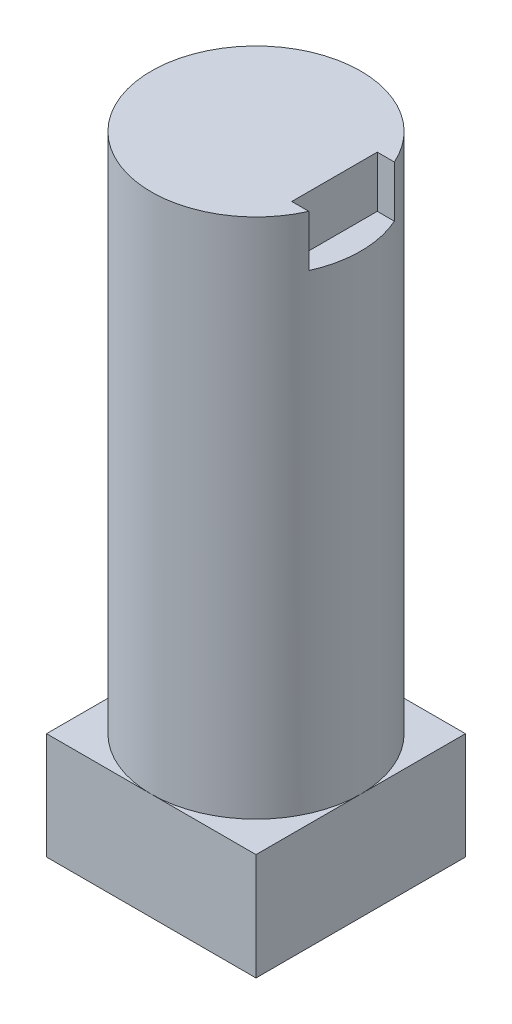
ISO-10303-21;
HEADER;
FILE_DESCRIPTION(('STEP AP214'),'2;1');
FILE_NAME('part.step','',(''),(''),'','','');
FILE_SCHEMA(('AUTOMOTIVE_DESIGN { 1 0 10303 214 1 1 1 1 }'));
ENDSEC;
DATA;
#1=APPLICATION_CONTEXT('core data for automotive mechanical design processes');
#2=APPLICATION_PROTOCOL_DEFINITION('international standard','automotive_design',2000,#1);
#3=PRODUCT_CONTEXT('',#1,'mechanical');
#4=PRODUCT('Part','Part','',(#3));
#5=PRODUCT_RELATED_PRODUCT_CATEGORY('part','',(#4));
#6=PRODUCT_DEFINITION_FORMATION('','',#4);
#7=PRODUCT_DEFINITION_CONTEXT('part definition',#1,'design');
#8=PRODUCT_DEFINITION('design','',#6,#7);
#9=PRODUCT_DEFINITION_SHAPE('','',#8);
#10=(LENGTH_UNIT() NAMED_UNIT(*) SI_UNIT(.MILLI.,.METRE.));
#11=(NAMED_UNIT(*) PLANE_ANGLE_UNIT() SI_UNIT($,.RADIAN.));
#12=(NAMED_UNIT(*) SI_UNIT($,.STERADIAN.) SOLID_ANGLE_UNIT());
#13=UNCERTAINTY_MEASURE_WITH_UNIT(LENGTH_MEASURE(1.E-05),#10,'distance_accuracy_value','');
#14=(GEOMETRIC_REPRESENTATION_CONTEXT(3) GLOBAL_UNCERTAINTY_ASSIGNED_CONTEXT((#13)) GLOBAL_UNIT_ASSIGNED_CONTEXT((#10,
#11,#12)) REPRESENTATION_CONTEXT('',''));
#15=CARTESIAN_POINT('',(0.,0.,0.));
#16=DIRECTION('',(0.,0.,1.));
#17=DIRECTION('',(1.,0.,0.));
#18=AXIS2_PLACEMENT_3D('',#15,#16,#17);
#19=CARTESIAN_POINT('',(-34.9241184124081,14.412388078501,22.3609994216903));
#20=DIRECTION('',(0.,-1.,0.));
#21=DIRECTION('',(0.,0.,-1.));
#22=AXIS2_PLACEMENT_3D('',#19,#20,#21);
#23=CYLINDRICAL_SURFACE('',#22,2.45);
#24=CARTESIAN_POINT('',(-34.9241184124081,-3.28761192149899,22.3609994216903));
#25=DIRECTION('',(0.,1.,0.));
#26=DIRECTION('',(0.,0.,1.));
#27=AXIS2_PLACEMENT_3D('',#24,#25,#26);
#28=CIRCLE('',#27,2.45);
#29=CARTESIAN_POINT('',(-34.9241184124081,-3.28761192149899,24.8109994216903));
#30=VERTEX_POINT('',#29);
#31=CARTESIAN_POINT('',(-32.4741184124081,-3.28761192149899,22.3609994216903));
#32=VERTEX_POINT('',#31);
#33=EDGE_CURVE('E153',#30,#32,#28,.T.);
#34=ORIENTED_EDGE('',*,*,#33,.T.);
#35=CARTESIAN_POINT('',(-34.9241184124081,-3.28761192149899,19.9109994216903));
#36=VERTEX_POINT('',#35);
#37=EDGE_CURVE('E57',#32,#36,#28,.T.);
#38=ORIENTED_EDGE('',*,*,#37,.T.);
#39=CARTESIAN_POINT('',(-37.3741184124081,-3.28761192149899,22.3609994216903));
#40=VERTEX_POINT('',#39);
#41=EDGE_CURVE('E207',#36,#40,#28,.T.);
#42=ORIENTED_EDGE('',*,*,#41,.T.);
#43=EDGE_CURVE('E71',#40,#30,#28,.T.);
#44=ORIENTED_EDGE('',*,*,#43,.T.);
#45=EDGE_LOOP('',(#34,#38,#42,#44));
#46=FACE_BOUND('',#45,.T.);
#47=CARTESIAN_POINT('',(-34.9241184124081,8.91238807850102,22.3609994216903));
#48=DIRECTION('',(0.,1.,0.));
#49=DIRECTION('',(0.,0.,1.));
#50=AXIS2_PLACEMENT_3D('',#47,#48,#49);
#51=CIRCLE('',#50,2.45);
#52=CARTESIAN_POINT('',(-32.6874914877736,8.91238807850102,23.3609994216903));
#53=VERTEX_POINT('',#52);
#54=CARTESIAN_POINT('',(-32.6874914877736,8.91238807850102,21.3609994216903));
#55=VERTEX_POINT('',#54);
#56=EDGE_CURVE('E125',#53,#55,#51,.F.);
#57=ORIENTED_EDGE('',*,*,#56,.T.);
#58=DIRECTION('',(0.,1.,0.));
#59=VECTOR('',#58,1.);
#60=CARTESIAN_POINT('',(-32.6874914877736,7.71238807850101,21.3609994216903));
#61=LINE('',#60,#59);
#62=CARTESIAN_POINT('',(-32.6874914877736,7.71238807850101,21.3609994216903));
#63=VERTEX_POINT('',#62);
#64=EDGE_CURVE('E134',#63,#55,#61,.T.);
#65=ORIENTED_EDGE('',*,*,#64,.F.);
#66=CARTESIAN_POINT('',(-34.9241184124081,7.71238807850101,22.3609994216903));
#67=DIRECTION('',(0.,1.,0.));
#68=DIRECTION('',(0.,0.,1.));
#69=AXIS2_PLACEMENT_3D('',#66,#67,#68);
#70=CIRCLE('',#69,2.45);
#71=CARTESIAN_POINT('',(-32.6874914877736,7.71238807850101,23.3609994216903));
#72=VERTEX_POINT('',#71);
#73=EDGE_CURVE('E238',#72,#63,#70,.T.);
#74=ORIENTED_EDGE('',*,*,#73,.F.);
#75=DIRECTION('',(0.,1.,0.));
#76=VECTOR('',#75,1.);
#77=CARTESIAN_POINT('',(-32.6874914877736,7.71238807850101,23.3609994216903));
#78=LINE('',#77,#76);
#79=EDGE_CURVE('E135',#72,#53,#78,.T.);
#80=ORIENTED_EDGE('',*,*,#79,.T.);
#81=EDGE_LOOP('',(#57,#65,#74,#80));
#82=FACE_BOUND('',#81,.T.);
#83=ADVANCED_FACE('F48',(#46,#82),#23,.T.);
#84=CARTESIAN_POINT('',(-30.3076921273144,7.71238807850101,23.3609994216903));
#85=DIRECTION('',(0.,0.,-1.));
#86=DIRECTION('',(-1.,0.,0.));
#87=AXIS2_PLACEMENT_3D('',#84,#85,#86);
#88=PLANE('',#87);
#89=DIRECTION('',(0.,1.,0.));
#90=VECTOR('',#89,1.);
#91=CARTESIAN_POINT('',(-33.0874914877736,7.71238807850101,23.3609994216903));
#92=LINE('',#91,#90);
#93=CARTESIAN_POINT('',(-33.0874914877736,7.71238807850101,23.3609994216903));
#94=VERTEX_POINT('',#93);
#95=CARTESIAN_POINT('',(-33.0874914877736,8.91238807850101,23.3609994216903));
#96=VERTEX_POINT('',#95);
#97=EDGE_CURVE('E147',#94,#96,#92,.T.);
#98=ORIENTED_EDGE('',*,*,#97,.T.);
#99=DIRECTION('',(1.,0.,0.));
#100=VECTOR('',#99,1.);
#101=CARTESIAN_POINT('',(-30.3076921273144,8.91238807850101,23.3609994216903));
#102=LINE('',#101,#100);
#103=EDGE_CURVE('E244',#96,#53,#102,.T.);
#104=ORIENTED_EDGE('',*,*,#103,.T.);
#105=ORIENTED_EDGE('',*,*,#79,.F.);
#106=DIRECTION('',(-1.,0.,0.));
#107=VECTOR('',#106,1.);
#108=CARTESIAN_POINT('',(-30.3076921273144,7.71238807850101,23.3609994216903));
#109=LINE('',#108,#107);
#110=EDGE_CURVE('E241',#72,#94,#109,.T.);
#111=ORIENTED_EDGE('',*,*,#110,.T.);
#112=EDGE_LOOP('',(#98,#104,#105,#111));
#113=FACE_BOUND('',#112,.T.);
#114=ADVANCED_FACE('F248',(#113),#88,.T.);
#115=CARTESIAN_POINT('',(-33.0874914877736,7.71238807850101,7.79325973955173));
#116=DIRECTION('',(-1.,0.,0.));
#117=DIRECTION('',(0.,0.,1.));
#118=AXIS2_PLACEMENT_3D('',#115,#116,#117);
#119=PLANE('',#118);
#120=DIRECTION('',(0.,0.,-1.));
#121=VECTOR('',#120,1.);
#122=CARTESIAN_POINT('',(-33.0874914877736,8.91238807850101,7.79325973955173));
#123=LINE('',#122,#121);
#124=CARTESIAN_POINT('',(-33.0874914877736,8.91238807850101,21.3609994216903));
#125=VERTEX_POINT('',#124);
#126=EDGE_CURVE('E63',#96,#125,#123,.T.);
#127=ORIENTED_EDGE('',*,*,#126,.F.);
#128=ORIENTED_EDGE('',*,*,#97,.F.);
#129=DIRECTION('',(0.,0.,1.));
#130=VECTOR('',#129,1.);
#131=CARTESIAN_POINT('',(-33.0874914877736,7.71238807850101,7.79325973955173));
#132=LINE('',#131,#130);
#133=CARTESIAN_POINT('',(-33.0874914877736,7.71238807850101,21.3609994216903));
#134=VERTEX_POINT('',#133);
#135=EDGE_CURVE('E149',#134,#94,#132,.T.);
#136=ORIENTED_EDGE('',*,*,#135,.F.);
#137=DIRECTION('',(0.,1.,0.));
#138=VECTOR('',#137,1.);
#139=CARTESIAN_POINT('',(-33.0874914877736,7.71238807850101,21.3609994216903));
#140=LINE('',#139,#138);
#141=EDGE_CURVE('E143',#134,#125,#140,.T.);
#142=ORIENTED_EDGE('',*,*,#141,.T.);
#143=EDGE_LOOP('',(#127,#128,#136,#142));
#144=FACE_BOUND('',#143,.T.);
#145=ADVANCED_FACE('F251',(#144),#119,.F.);
#146=CARTESIAN_POINT('',(-30.3076921273144,7.71238807850101,21.3609994216903));
#147=DIRECTION('',(0.,0.,-1.));
#148=DIRECTION('',(-1.,0.,0.));
#149=AXIS2_PLACEMENT_3D('',#146,#147,#148);
#150=PLANE('',#149);
#151=DIRECTION('',(1.,0.,0.));
#152=VECTOR('',#151,1.);
#153=CARTESIAN_POINT('',(-30.3076921273144,8.91238807850101,21.3609994216903));
#154=LINE('',#153,#152);
#155=EDGE_CURVE('E13',#125,#55,#154,.T.);
#156=ORIENTED_EDGE('',*,*,#155,.F.);
#157=ORIENTED_EDGE('',*,*,#141,.F.);
#158=DIRECTION('',(-1.,0.,0.));
#159=VECTOR('',#158,1.);
#160=CARTESIAN_POINT('',(-30.3076921273144,7.71238807850101,21.3609994216903));
#161=LINE('',#160,#159);
#162=EDGE_CURVE('E140',#63,#134,#161,.T.);
#163=ORIENTED_EDGE('',*,*,#162,.F.);
#164=ORIENTED_EDGE('',*,*,#64,.T.);
#165=EDGE_LOOP('',(#156,#157,#163,#164));
#166=FACE_BOUND('',#165,.T.);
#167=ADVANCED_FACE('F138',(#166),#150,.F.);
#168=CARTESIAN_POINT('',(-34.9241184124081,-3.28761192149899,22.3609994216903));
#169=DIRECTION('',(0.,1.,0.));
#170=DIRECTION('',(0.,0.,1.));
#171=AXIS2_PLACEMENT_3D('',#168,#169,#170);
#172=PLANE('',#171);
#173=ORIENTED_EDGE('',*,*,#33,.F.);
#174=DIRECTION('',(1.,0.,0.));
#175=VECTOR('',#174,1.);
#176=CARTESIAN_POINT('',(-37.3741184124081,-3.28761192149899,24.8109994216903));
#177=LINE('',#176,#175);
#178=CARTESIAN_POINT('',(-32.4741184124081,-3.28761192149899,24.8109994216903));
#179=VERTEX_POINT('',#178);
#180=EDGE_CURVE('E162',#30,#179,#177,.T.);
#181=ORIENTED_EDGE('',*,*,#180,.T.);
#182=DIRECTION('',(0.,0.,-1.));
#183=VECTOR('',#182,1.);
#184=CARTESIAN_POINT('',(-32.4741184124081,-3.28761192149899,24.8109994216903));
#185=LINE('',#184,#183);
#186=EDGE_CURVE('E163',#179,#32,#185,.T.);
#187=ORIENTED_EDGE('',*,*,#186,.T.);
#188=EDGE_LOOP('',(#173,#181,#187));
#189=FACE_BOUND('',#188,.T.);
#190=ADVANCED_FACE('F223',(#189),#172,.T.);
#191=ORIENTED_EDGE('',*,*,#37,.F.);
#192=CARTESIAN_POINT('',(-32.4741184124081,-3.28761192149899,19.9109994216903));
#193=VERTEX_POINT('',#192);
#194=EDGE_CURVE('E161',#32,#193,#185,.T.);
#195=ORIENTED_EDGE('',*,*,#194,.T.);
#196=DIRECTION('',(1.,0.,0.));
#197=VECTOR('',#196,1.);
#198=CARTESIAN_POINT('',(-37.3741184124081,-3.28761192149899,19.9109994216903));
#199=LINE('',#198,#197);
#200=EDGE_CURVE('E167',#36,#193,#199,.T.);
#201=ORIENTED_EDGE('',*,*,#200,.F.);
#202=EDGE_LOOP('',(#191,#195,#201));
#203=FACE_BOUND('',#202,.T.);
#204=ADVANCED_FACE('F218',(#203),#172,.T.);
#205=ORIENTED_EDGE('',*,*,#41,.F.);
#206=CARTESIAN_POINT('',(-37.3741184124081,-3.28761192149899,19.9109994216903));
#207=VERTEX_POINT('',#206);
#208=EDGE_CURVE('E168',#207,#36,#199,.T.);
#209=ORIENTED_EDGE('',*,*,#208,.F.);
#210=DIRECTION('',(0.,0.,-1.));
#211=VECTOR('',#210,1.);
#212=CARTESIAN_POINT('',(-37.3741184124081,-3.28761192149899,24.8109994216903));
#213=LINE('',#212,#211);
#214=EDGE_CURVE('E172',#40,#207,#213,.T.);
#215=ORIENTED_EDGE('',*,*,#214,.F.);
#216=EDGE_LOOP('',(#205,#209,#215));
#217=FACE_BOUND('',#216,.T.);
#218=ADVANCED_FACE('F277',(#217),#172,.T.);
#219=CARTESIAN_POINT('',(-37.3741184124081,-3.28761192149899,24.8109994216903));
#220=DIRECTION('',(0.,0.,-1.));
#221=DIRECTION('',(-1.,0.,0.));
#222=AXIS2_PLACEMENT_3D('',#219,#220,#221);
#223=PLANE('',#222);
#224=DIRECTION('',(1.,0.,0.));
#225=VECTOR('',#224,1.);
#226=CARTESIAN_POINT('',(-37.3741184124081,-5.78761192149899,24.8109994216903));
#227=LINE('',#226,#225);
#228=CARTESIAN_POINT('',(-37.3741184124081,-5.78761192149899,24.8109994216903));
#229=VERTEX_POINT('',#228);
#230=CARTESIAN_POINT('',(-32.4741184124081,-5.78761192149899,24.8109994216903));
#231=VERTEX_POINT('',#230);
#232=EDGE_CURVE('E157',#229,#231,#227,.T.);
#233=ORIENTED_EDGE('',*,*,#232,.T.);
#234=DIRECTION('',(0.,-1.,0.));
#235=VECTOR('',#234,1.);
#236=CARTESIAN_POINT('',(-32.4741184124081,-3.28761192149899,24.8109994216903));
#237=LINE('',#236,#235);
#238=EDGE_CURVE('E200',#179,#231,#237,.T.);
#239=ORIENTED_EDGE('',*,*,#238,.F.);
#240=ORIENTED_EDGE('',*,*,#180,.F.);
#241=CARTESIAN_POINT('',(-37.3741184124081,-3.28761192149899,24.8109994216903));
#242=VERTEX_POINT('',#241);
#243=EDGE_CURVE('E158',#242,#30,#177,.T.);
#244=ORIENTED_EDGE('',*,*,#243,.F.);
#245=DIRECTION('',(0.,-1.,0.));
#246=VECTOR('',#245,1.);
#247=CARTESIAN_POINT('',(-37.3741184124081,-3.28761192149899,24.8109994216903));
#248=LINE('',#247,#246);
#249=EDGE_CURVE('E177',#242,#229,#248,.T.);
#250=ORIENTED_EDGE('',*,*,#249,.T.);
#251=EDGE_LOOP('',(#233,#239,#240,#244,#250));
#252=FACE_BOUND('',#251,.T.);
#253=ADVANCED_FACE('F50',(#252),#223,.F.);
#254=CARTESIAN_POINT('',(-32.4741184124081,-3.28761192149899,24.8109994216903));
#255=DIRECTION('',(-1.,0.,0.));
#256=DIRECTION('',(0.,0.,1.));
#257=AXIS2_PLACEMENT_3D('',#254,#255,#256);
#258=PLANE('',#257);
#259=DIRECTION('',(0.,0.,-1.));
#260=VECTOR('',#259,1.);
#261=CARTESIAN_POINT('',(-32.4741184124081,-5.78761192149899,24.8109994216903));
#262=LINE('',#261,#260);
#263=CARTESIAN_POINT('',(-32.4741184124081,-5.78761192149899,19.9109994216903));
#264=VERTEX_POINT('',#263);
#265=EDGE_CURVE('E181',#231,#264,#262,.T.);
#266=ORIENTED_EDGE('',*,*,#265,.T.);
#267=DIRECTION('',(0.,-1.,0.));
#268=VECTOR('',#267,1.);
#269=CARTESIAN_POINT('',(-32.4741184124081,-3.28761192149899,19.9109994216903));
#270=LINE('',#269,#268);
#271=EDGE_CURVE('E198',#193,#264,#270,.T.);
#272=ORIENTED_EDGE('',*,*,#271,.F.);
#273=ORIENTED_EDGE('',*,*,#194,.F.);
#274=ORIENTED_EDGE('',*,*,#186,.F.);
#275=ORIENTED_EDGE('',*,*,#238,.T.);
#276=EDGE_LOOP('',(#266,#272,#273,#274,#275));
#277=FACE_BOUND('',#276,.T.);
#278=ADVANCED_FACE('F220',(#277),#258,.F.);
#279=CARTESIAN_POINT('',(-37.3741184124081,-3.28761192149899,19.9109994216903));
#280=DIRECTION('',(0.,0.,-1.));
#281=DIRECTION('',(-1.,0.,0.));
#282=AXIS2_PLACEMENT_3D('',#279,#280,#281);
#283=PLANE('',#282);
#284=DIRECTION('',(1.,0.,0.));
#285=VECTOR('',#284,1.);
#286=CARTESIAN_POINT('',(-37.3741184124081,-5.78761192149899,19.9109994216903));
#287=LINE('',#286,#285);
#288=CARTESIAN_POINT('',(-37.3741184124081,-5.78761192149899,19.9109994216903));
#289=VERTEX_POINT('',#288);
#290=EDGE_CURVE('E185',#289,#264,#287,.T.);
#291=ORIENTED_EDGE('',*,*,#290,.F.);
#292=DIRECTION('',(0.,-1.,0.));
#293=VECTOR('',#292,1.);
#294=CARTESIAN_POINT('',(-37.3741184124081,-3.28761192149899,19.9109994216903));
#295=LINE('',#294,#293);
#296=EDGE_CURVE('E195',#207,#289,#295,.T.);
#297=ORIENTED_EDGE('',*,*,#296,.F.);
#298=ORIENTED_EDGE('',*,*,#208,.T.);
#299=ORIENTED_EDGE('',*,*,#200,.T.);
#300=ORIENTED_EDGE('',*,*,#271,.T.);
#301=EDGE_LOOP('',(#291,#297,#298,#299,#300));
#302=FACE_BOUND('',#301,.T.);
#303=ADVANCED_FACE('F281',(#302),#283,.T.);
#304=CARTESIAN_POINT('',(-37.3741184124081,-3.28761192149899,24.8109994216903));
#305=DIRECTION('',(-1.,0.,0.));
#306=DIRECTION('',(0.,0.,1.));
#307=AXIS2_PLACEMENT_3D('',#304,#305,#306);
#308=PLANE('',#307);
#309=DIRECTION('',(0.,0.,-1.));
#310=VECTOR('',#309,1.);
#311=CARTESIAN_POINT('',(-37.3741184124081,-5.78761192149899,24.8109994216903));
#312=LINE('',#311,#310);
#313=EDGE_CURVE('E189',#229,#289,#312,.T.);
#314=ORIENTED_EDGE('',*,*,#313,.F.);
#315=ORIENTED_EDGE('',*,*,#249,.F.);
#316=EDGE_CURVE('E173',#242,#40,#213,.T.);
#317=ORIENTED_EDGE('',*,*,#316,.T.);
#318=ORIENTED_EDGE('',*,*,#214,.T.);
#319=ORIENTED_EDGE('',*,*,#296,.T.);
#320=EDGE_LOOP('',(#314,#315,#317,#318,#319));
#321=FACE_BOUND('',#320,.T.);
#322=ADVANCED_FACE('F276',(#321),#308,.T.);
#323=ORIENTED_EDGE('',*,*,#43,.F.);
#324=ORIENTED_EDGE('',*,*,#316,.F.);
#325=ORIENTED_EDGE('',*,*,#243,.T.);
#326=EDGE_LOOP('',(#323,#324,#325));
#327=FACE_BOUND('',#326,.T.);
#328=ADVANCED_FACE('F263',(#327),#172,.T.);
#329=CARTESIAN_POINT('',(-34.9241184124081,-5.78761192149899,22.3609994216903));
#330=DIRECTION('',(0.,1.,0.));
#331=DIRECTION('',(0.,0.,1.));
#332=AXIS2_PLACEMENT_3D('',#329,#330,#331);
#333=PLANE('',#332);
#334=ORIENTED_EDGE('',*,*,#232,.F.);
#335=ORIENTED_EDGE('',*,*,#313,.T.);
#336=ORIENTED_EDGE('',*,*,#290,.T.);
#337=ORIENTED_EDGE('',*,*,#265,.F.);
#338=EDGE_LOOP('',(#334,#335,#336,#337));
#339=FACE_BOUND('',#338,.T.);
#340=ADVANCED_FACE('F256',(#339),#333,.F.);
#341=CARTESIAN_POINT('',(-30.3076921273144,7.71238807850101,7.79325973955173));
#342=DIRECTION('',(0.,1.,0.));
#343=DIRECTION('',(0.,0.,1.));
#344=AXIS2_PLACEMENT_3D('',#341,#342,#343);
#345=PLANE('',#344);
#346=ORIENTED_EDGE('',*,*,#110,.F.);
#347=ORIENTED_EDGE('',*,*,#73,.T.);
#348=ORIENTED_EDGE('',*,*,#162,.T.);
#349=ORIENTED_EDGE('',*,*,#135,.T.);
#350=EDGE_LOOP('',(#346,#347,#348,#349));
#351=FACE_BOUND('',#350,.T.);
#352=ADVANCED_FACE('F254',(#351),#345,.T.);
#353=CARTESIAN_POINT('',(-34.9241184124081,8.91238807850101,22.3609994216903));
#354=DIRECTION('',(0.,1.,0.));
#355=DIRECTION('',(0.,0.,1.));
#356=AXIS2_PLACEMENT_3D('',#353,#354,#355);
#357=PLANE('',#356);
#358=ORIENTED_EDGE('',*,*,#126,.T.);
#359=ORIENTED_EDGE('',*,*,#155,.T.);
#360=ORIENTED_EDGE('',*,*,#56,.F.);
#361=ORIENTED_EDGE('',*,*,#103,.F.);
#362=EDGE_LOOP('',(#358,#359,#360,#361));
#363=FACE_BOUND('',#362,.T.);
#364=ADVANCED_FACE('F124',(#363),#357,.T.);
#365=CLOSED_SHELL('',(#83,#114,#145,#167,#190,#204,#218,#253,#278,#303,#322,#328,#340,#352,#364));
#366=MANIFOLD_SOLID_BREP('B2',#365);
#367=ADVANCED_BREP_SHAPE_REPRESENTATION('',(#18,#366),#14);
#368=SHAPE_DEFINITION_REPRESENTATION(#9,#367);
ENDSEC;
END-ISO-10303-21;
